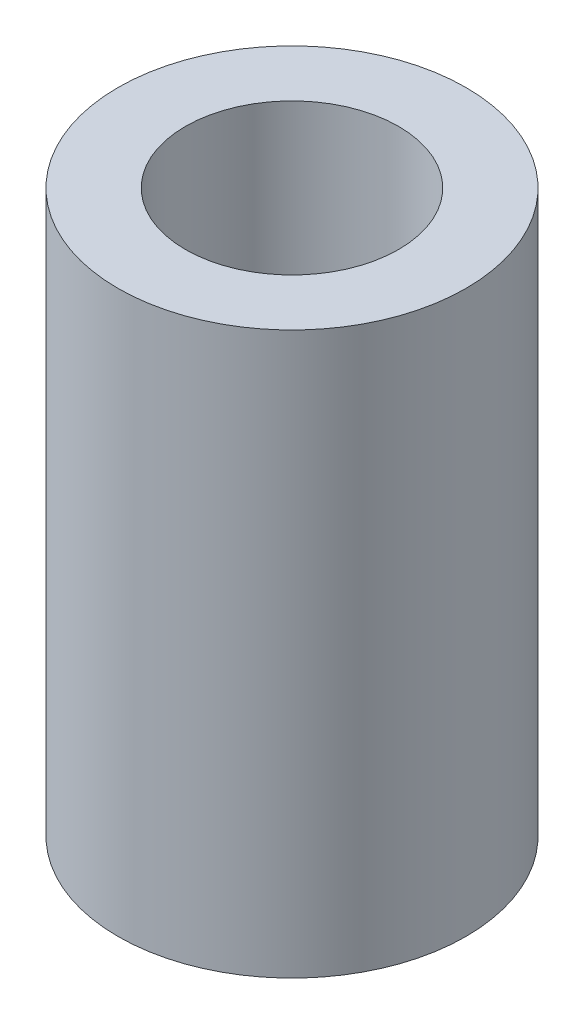
ISO-10303-21;
HEADER;
FILE_DESCRIPTION(('STEP AP214'),'2;1');
FILE_NAME('part.step','',(''),(''),'','','');
FILE_SCHEMA(('AUTOMOTIVE_DESIGN { 1 0 10303 214 1 1 1 1 }'));
ENDSEC;
DATA;
#1=APPLICATION_CONTEXT('core data for automotive mechanical design processes');
#2=APPLICATION_PROTOCOL_DEFINITION('international standard','automotive_design',2000,#1);
#3=PRODUCT_CONTEXT('',#1,'mechanical');
#4=PRODUCT('Part','Part','',(#3));
#5=PRODUCT_RELATED_PRODUCT_CATEGORY('part','',(#4));
#6=PRODUCT_DEFINITION_FORMATION('','',#4);
#7=PRODUCT_DEFINITION_CONTEXT('part definition',#1,'design');
#8=PRODUCT_DEFINITION('design','',#6,#7);
#9=PRODUCT_DEFINITION_SHAPE('','',#8);
#10=(LENGTH_UNIT() NAMED_UNIT(*) SI_UNIT(.MILLI.,.METRE.));
#11=(NAMED_UNIT(*) PLANE_ANGLE_UNIT() SI_UNIT($,.RADIAN.));
#12=(NAMED_UNIT(*) SI_UNIT($,.STERADIAN.) SOLID_ANGLE_UNIT());
#13=UNCERTAINTY_MEASURE_WITH_UNIT(LENGTH_MEASURE(1.E-05),#10,'distance_accuracy_value','');
#14=(GEOMETRIC_REPRESENTATION_CONTEXT(3) GLOBAL_UNCERTAINTY_ASSIGNED_CONTEXT((#13)) GLOBAL_UNIT_ASSIGNED_CONTEXT((#10,
#11,#12)) REPRESENTATION_CONTEXT('',''));
#15=CARTESIAN_POINT('',(0.,0.,0.));
#16=DIRECTION('',(0.,0.,1.));
#17=DIRECTION('',(1.,0.,0.));
#18=AXIS2_PLACEMENT_3D('',#15,#16,#17);
#19=CARTESIAN_POINT('',(-1.12375766391149,36.6,0.));
#20=DIRECTION('',(-1.,0.,0.));
#21=DIRECTION('',(0.,0.,1.));
#22=AXIS2_PLACEMENT_3D('',#19,#20,#21);
#23=PLANE('',#22);
#24=DIRECTION('',(0.,-1.,0.));
#25=VECTOR('',#24,1.);
#26=CARTESIAN_POINT('',(-1.12375766391149,36.6,1.06755267448505));
#27=LINE('',#26,#25);
#28=CARTESIAN_POINT('',(-1.12375766391149,8.7,1.06755267448505));
#29=VERTEX_POINT('',#28);
#30=CARTESIAN_POINT('',(-1.12375766391149,6.23497021876877,1.06755267448505));
#31=VERTEX_POINT('',#30);
#32=EDGE_CURVE('E154',#29,#31,#27,.T.);
#33=ORIENTED_EDGE('',*,*,#32,.T.);
#34=CARTESIAN_POINT('',(-1.12375766391149,4.19773403039988,0.));
#35=DIRECTION('',(-1.,0.,0.));
#36=DIRECTION('',(0.,0.,1.));
#37=AXIS2_PLACEMENT_3D('',#34,#35,#36);
#38=CIRCLE('',#37,2.3);
#39=CARTESIAN_POINT('',(-1.12375766391149,6.23497021876877,-1.06755267448505));
#40=VERTEX_POINT('',#39);
#41=EDGE_CURVE('E159',#31,#40,#38,.T.);
#42=ORIENTED_EDGE('',*,*,#41,.T.);
#43=DIRECTION('',(0.,-1.,0.));
#44=VECTOR('',#43,1.);
#45=CARTESIAN_POINT('',(-1.12375766391149,36.6,-1.06755267448505));
#46=LINE('',#45,#44);
#47=CARTESIAN_POINT('',(-1.12375766391149,8.7,-1.06755267448505));
#48=VERTEX_POINT('',#47);
#49=EDGE_CURVE('E119',#48,#40,#46,.T.);
#50=ORIENTED_EDGE('',*,*,#49,.F.);
#51=DIRECTION('',(0.,0.,-1.));
#52=VECTOR('',#51,1.);
#53=CARTESIAN_POINT('',(-1.12375766391149,8.7,0.));
#54=LINE('',#53,#52);
#55=EDGE_CURVE('E105',#29,#48,#54,.T.);
#56=ORIENTED_EDGE('',*,*,#55,.F.);
#57=EDGE_LOOP('',(#33,#42,#50,#56));
#58=FACE_BOUND('',#57,.T.);
#59=ADVANCED_FACE('F39',(#58),#23,.F.);
#60=CARTESIAN_POINT('',(0.,25.,0.));
#61=DIRECTION('',(0.,-1.,0.));
#62=DIRECTION('',(0.,0.,-1.));
#63=AXIS2_PLACEMENT_3D('',#60,#61,#62);
#64=CYLINDRICAL_SURFACE('',#63,4.75);
#65=CARTESIAN_POINT('',(0.,25.,0.));
#66=DIRECTION('',(0.,1.,0.));
#67=DIRECTION('',(0.,0.,1.));
#68=AXIS2_PLACEMENT_3D('',#65,#66,#67);
#69=CIRCLE('',#68,4.75);
#70=CARTESIAN_POINT('',(0.,25.,4.75));
#71=VERTEX_POINT('',#70);
#72=EDGE_CURVE('E169',#71,#71,#69,.T.);
#73=ORIENTED_EDGE('',*,*,#72,.T.);
#74=EDGE_LOOP('',(#73));
#75=FACE_BOUND('',#74,.T.);
#76=CARTESIAN_POINT('',(0.,8.7,0.));
#77=DIRECTION('',(0.,-1.,0.));
#78=DIRECTION('',(0.,0.,-1.));
#79=AXIS2_PLACEMENT_3D('',#76,#77,#78);
#80=CIRCLE('',#79,4.75);
#81=CARTESIAN_POINT('',(0.,8.7,-4.75));
#82=VERTEX_POINT('',#81);
#83=EDGE_CURVE('E163',#82,#82,#80,.T.);
#84=ORIENTED_EDGE('',*,*,#83,.T.);
#85=EDGE_LOOP('',(#84));
#86=FACE_BOUND('',#85,.T.);
#87=ADVANCED_FACE('F201',(#75,#86),#64,.F.);
#88=CARTESIAN_POINT('',(0.,25.,0.));
#89=DIRECTION('',(0.,-1.,0.));
#90=DIRECTION('',(0.,0.,-1.));
#91=AXIS2_PLACEMENT_3D('',#88,#89,#90);
#92=CYLINDRICAL_SURFACE('',#91,7.75);
#93=CARTESIAN_POINT('',(-7.40084454640144,4.19773403039988,-2.3));
#94=CARTESIAN_POINT('',(-7.40084596710491,4.3238342219509,-2.29999826061035));
#95=CARTESIAN_POINT('',(-7.40410267236931,4.44995166886507,-2.28959433657055));
#96=CARTESIAN_POINT('',(-7.41672693487905,4.6985039511843,-2.24835781646923));
#97=CARTESIAN_POINT('',(-7.42609663450528,4.82093747976796,-2.21751805833608));
#98=CARTESIAN_POINT('',(-7.44979425816975,5.0584880693148,-2.13654558421231));
#99=CARTESIAN_POINT('',(-7.46411406328841,5.17361674763033,-2.08644444479458));
#100=CARTESIAN_POINT('',(-7.49608749362793,5.39386204681906,-1.96847471285967));
#101=CARTESIAN_POINT('',(-7.5137415945252,5.49897723592774,-1.90060358471081));
#102=CARTESIAN_POINT('',(-7.55100758274335,5.6994670992972,-1.74677028598971));
#103=CARTESIAN_POINT('',(-7.57066049729886,5.79448582109711,-1.6603540389876));
#104=CARTESIAN_POINT('',(-7.60935889073277,5.96891760486302,-1.47285699392236));
#105=CARTESIAN_POINT('',(-7.6284042929153,6.0483287029133,-1.37177435315707));
#106=CARTESIAN_POINT('',(-7.66420696124225,6.19083047428014,-1.15528818238506));
#107=CARTESIAN_POINT('',(-7.68091024524189,6.25355913271964,-1.03963664794872));
#108=CARTESIAN_POINT('',(-7.70967060430952,6.35854015173924,-0.798846729124816));
#109=CARTESIAN_POINT('',(-7.7217286588025,6.40079682922552,-0.67371035123852));
#110=CARTESIAN_POINT('',(-7.73954966825425,6.4624590502671,-0.421226024082658));
#111=CARTESIAN_POINT('',(-7.74547961650724,6.48247196711275,-0.294038407770543));
#112=CARTESIAN_POINT('',(-7.75096393032413,6.50099812045078,-0.0379817805125363));
#113=CARTESIAN_POINT('',(-7.7505196073059,6.49951577929354,0.0908868791313423));
#114=CARTESIAN_POINT('',(-7.7434239222355,6.47550322092418,0.342389870740012));
#115=CARTESIAN_POINT('',(-7.73696648599736,6.45363057645066,0.465093315936343));
#116=CARTESIAN_POINT('',(-7.71880512648328,6.39053124036349,0.705002349244682));
#117=CARTESIAN_POINT('',(-7.7071008737427,6.34930333336245,0.822207591596089));
#118=CARTESIAN_POINT('',(-7.67949091982366,6.24821269449372,1.04936794217916));
#119=CARTESIAN_POINT('',(-7.66353849220174,6.18814130490513,1.15922428051381));
#120=CARTESIAN_POINT('',(-7.62912702070038,6.05123342536467,1.36750908889339));
#121=CARTESIAN_POINT('',(-7.61066739272996,5.97439302627483,1.46593488607622));
#122=CARTESIAN_POINT('',(-7.57239697054158,5.80270955915567,1.65248936300832));
#123=CARTESIAN_POINT('',(-7.55256147623185,5.70729630396951,1.74008893466056));
#124=CARTESIAN_POINT('',(-7.51438627788777,5.5029389977781,1.89819161794733));
#125=CARTESIAN_POINT('',(-7.4960467160745,5.39399366273112,1.96869310528961));
#126=CARTESIAN_POINT('',(-7.46282359054564,5.16429697089723,2.09113445545842));
#127=CARTESIAN_POINT('',(-7.4479734020001,5.04344614821127,2.14289743894261));
#128=CARTESIAN_POINT('',(-7.42380789677625,4.7942004591895,2.22518235059243));
#129=CARTESIAN_POINT('',(-7.41449081997391,4.6658080061997,2.25571103407667));
#130=CARTESIAN_POINT('',(-7.40283163852407,4.41015065417582,2.2936796395818));
#131=CARTESIAN_POINT('',(-7.40024714408484,4.28301593333333,2.30192234529745));
#132=CARTESIAN_POINT('',(-7.40167620065586,4.02917724983528,2.29732382076125));
#133=CARTESIAN_POINT('',(-7.40568885157593,3.90247323077974,2.28448546673172));
#134=CARTESIAN_POINT('',(-7.41962254419889,3.65641451987731,2.23880351521233));
#135=CARTESIAN_POINT('',(-7.42939179316149,3.53695503185814,2.20647339610327));
#136=CARTESIAN_POINT('',(-7.45358157267206,3.30516303796958,2.12331918638643));
#137=CARTESIAN_POINT('',(-7.46800281079959,3.19283161941044,2.07249228221912));
#138=CARTESIAN_POINT('',(-7.50034446361884,2.97520994053927,1.95225388685973));
#139=CARTESIAN_POINT('',(-7.51834711058228,2.87018340756084,1.88238773840295));
#140=CARTESIAN_POINT('',(-7.55564485018682,2.6730515560477,1.72659637939457));
#141=CARTESIAN_POINT('',(-7.57494024480165,2.58094927215363,1.64066740826764));
#142=CARTESIAN_POINT('',(-7.61350922017085,2.40878725470479,1.45142148380556));
#143=CARTESIAN_POINT('',(-7.6327558387679,2.32929579160812,1.34758080020375));
#144=CARTESIAN_POINT('',(-7.6683418951798,2.18885465773264,1.12757740491057));
#145=CARTESIAN_POINT('',(-7.68468147952493,2.12790405228421,1.0114153147562));
#146=CARTESIAN_POINT('',(-7.71251148021074,2.02686229511454,0.770844503911402));
#147=CARTESIAN_POINT('',(-7.72403816720745,1.98661456902562,0.646505953142204));
#148=CARTESIAN_POINT('',(-7.74110382957088,1.92771334987705,0.392427651456684));
#149=CARTESIAN_POINT('',(-7.74664447805598,1.909053822738,0.262689420303913));
#150=CARTESIAN_POINT('',(-7.75101421418239,1.89430955873376,0.00675166615421869));
#151=CARTESIAN_POINT('',(-7.75008858303398,1.89739983485735,-0.119396741236597));
#152=CARTESIAN_POINT('',(-7.74220549939041,1.92410102710831,-0.3692995490959));
#153=CARTESIAN_POINT('',(-7.7352483763988,1.94771082224386,-0.493054079965547));
#154=CARTESIAN_POINT('',(-7.71615190175865,2.01427431091141,-0.733416741463828));
#155=CARTESIAN_POINT('',(-7.7040667290909,2.05702601942284,-0.850085406075459));
#156=CARTESIAN_POINT('',(-7.6759648625946,2.16047940917894,-1.07465567940296));
#157=CARTESIAN_POINT('',(-7.65994753074731,2.2211840037251,-1.18255586158936));
#158=CARTESIAN_POINT('',(-7.62503996846125,2.36103784887781,-1.39021860108758));
#159=CARTESIAN_POINT('',(-7.60607514972016,2.44070775587925,-1.4896178778892));
#160=CARTESIAN_POINT('',(-7.56765460408595,2.61528809596758,-1.67391264494727));
#161=CARTESIAN_POINT('',(-7.54819873849178,2.71020287666161,-1.75880398346211));
#162=CARTESIAN_POINT('',(-7.51033645278872,2.91588087419198,-1.91414087210097));
#163=CARTESIAN_POINT('',(-7.49197678758514,3.02702367567372,-1.98409646894836));
#164=CARTESIAN_POINT('',(-7.45912537797488,3.26001939062547,-2.10424598972115));
#165=CARTESIAN_POINT('',(-7.44463170435396,3.381866921693,-2.15444977619488));
#166=CARTESIAN_POINT('',(-7.42264663975452,3.61855103184784,-2.22893436697839));
#167=CARTESIAN_POINT('',(-7.41454693949082,3.73261222901795,-2.25551171471803));
#168=CARTESIAN_POINT('',(-7.40364573686908,3.96368905055719,-2.29104366425712));
#169=CARTESIAN_POINT('',(-7.40084322788787,4.08070410932149,-2.30000161427695));
#170=CARTESIAN_POINT('',(-7.40084454640144,4.19773403039988,-2.3));
#171=B_SPLINE_CURVE_WITH_KNOTS('',3,(#93,#94,#95,#96,#97,#98,#99,#100,#101,#102,#103,#104,#105,
#106,#107,#108,#109,#110,#111,#112,#113,#114,#115,#116,#117,#118,#119,#120,#121,#122,#123,#124,
#125,#126,#127,#128,#129,#130,#131,#132,#133,#134,#135,#136,#137,#138,#139,#140,#141,#142,#143,
#144,#145,#146,#147,#148,#149,#150,#151,#152,#153,#154,#155,#156,#157,#158,#159,#160,#161,#162,
#163,#164,#165,#166,#167,#168,#169,#170),.UNSPECIFIED.,.T.,.F.,(4,2,2,2,2,2,2,2,2,2,2,2,2,2,2,2,
2,2,2,2,2,2,2,2,2,2,2,2,2,2,2,2,2,2,2,2,2,2,4),(0.,0.377869012965707,0.755870526385558,
1.1332549790472,1.51069331075154,1.89871941824612,2.28679432005994,2.68270713048679,
3.07853641879728,3.46326952469144,3.84792347822311,4.22058648988702,4.59327290554873,
4.97024120357905,5.34729747330635,5.7385903607886,6.12992040595729,6.52485354774898,
6.91966099097986,7.30004441548739,7.68037594619021,8.05110114594036,8.42188276055891,
8.80244015090164,9.18308674792963,9.57774874348553,9.97239084030002,10.3640027042959,
10.7555050830865,11.1322397208629,11.5089537787271,11.8817831586162,12.2546730725571,
12.6393060568089,13.0240489279669,13.4199420280461,13.8156371976433,14.1663931017357,
14.5170823451177),.UNSPECIFIED.);
#172=CARTESIAN_POINT('',(-7.40084454640144,4.19773403039988,-2.3));
#173=VERTEX_POINT('',#172);
#174=EDGE_CURVE('E230',#173,#173,#171,.T.);
#175=ORIENTED_EDGE('',*,*,#174,.T.);
#176=EDGE_LOOP('',(#175));
#177=FACE_BOUND('',#176,.T.);
#178=CARTESIAN_POINT('',(0.,0.,0.));
#179=DIRECTION('',(0.,1.,0.));
#180=DIRECTION('',(0.,0.,1.));
#181=AXIS2_PLACEMENT_3D('',#178,#179,#180);
#182=CIRCLE('',#181,7.75);
#183=CARTESIAN_POINT('',(0.,0.,7.75));
#184=VERTEX_POINT('',#183);
#185=EDGE_CURVE('E180',#184,#184,#182,.T.);
#186=ORIENTED_EDGE('',*,*,#185,.T.);
#187=EDGE_LOOP('',(#186));
#188=FACE_BOUND('',#187,.T.);
#189=CARTESIAN_POINT('',(0.,25.,0.));
#190=DIRECTION('',(0.,1.,0.));
#191=DIRECTION('',(0.,0.,1.));
#192=AXIS2_PLACEMENT_3D('',#189,#190,#191);
#193=CIRCLE('',#192,7.75);
#194=CARTESIAN_POINT('',(0.,25.,7.75));
#195=VERTEX_POINT('',#194);
#196=EDGE_CURVE('E181',#195,#195,#193,.T.);
#197=ORIENTED_EDGE('',*,*,#196,.F.);
#198=EDGE_LOOP('',(#197));
#199=FACE_BOUND('',#198,.T.);
#200=ADVANCED_FACE('F41',(#177,#188,#199),#92,.T.);
#201=CARTESIAN_POINT('',(0.,25.,0.));
#202=DIRECTION('',(0.,1.,0.));
#203=DIRECTION('',(0.,0.,1.));
#204=AXIS2_PLACEMENT_3D('',#201,#202,#203);
#205=PLANE('',#204);
#206=ORIENTED_EDGE('',*,*,#72,.F.);
#207=EDGE_LOOP('',(#206));
#208=FACE_BOUND('',#207,.T.);
#209=ORIENTED_EDGE('',*,*,#196,.T.);
#210=EDGE_LOOP('',(#209));
#211=FACE_BOUND('',#210,.T.);
#212=ADVANCED_FACE('F209',(#208,#211),#205,.T.);
#213=CARTESIAN_POINT('',(0.,0.,0.));
#214=DIRECTION('',(0.,1.,0.));
#215=DIRECTION('',(0.,0.,1.));
#216=AXIS2_PLACEMENT_3D('',#213,#214,#215);
#217=PLANE('',#216);
#218=CARTESIAN_POINT('',(0.,0.,0.));
#219=DIRECTION('',(0.,-1.,0.));
#220=DIRECTION('',(0.,0.,-1.));
#221=AXIS2_PLACEMENT_3D('',#218,#219,#220);
#222=CIRCLE('',#221,1.55);
#223=CARTESIAN_POINT('',(-1.12375766391149,0.,-1.06755267448505));
#224=VERTEX_POINT('',#223);
#225=CARTESIAN_POINT('',(-1.12375766391149,0.,1.06755267448505));
#226=VERTEX_POINT('',#225);
#227=EDGE_CURVE('E173',#224,#226,#222,.T.);
#228=ORIENTED_EDGE('',*,*,#227,.F.);
#229=DIRECTION('',(0.,0.,-1.));
#230=VECTOR('',#229,1.);
#231=CARTESIAN_POINT('',(-1.12375766391149,0.,0.));
#232=LINE('',#231,#230);
#233=EDGE_CURVE('E226',#226,#224,#232,.T.);
#234=ORIENTED_EDGE('',*,*,#233,.F.);
#235=EDGE_LOOP('',(#228,#234));
#236=FACE_BOUND('',#235,.T.);
#237=ORIENTED_EDGE('',*,*,#185,.F.);
#238=EDGE_LOOP('',(#237));
#239=FACE_BOUND('',#238,.T.);
#240=ADVANCED_FACE('F197',(#236,#239),#217,.F.);
#241=CARTESIAN_POINT('',(0.,8.7,0.));
#242=DIRECTION('',(0.,-1.,0.));
#243=DIRECTION('',(0.,0.,-1.));
#244=AXIS2_PLACEMENT_3D('',#241,#242,#243);
#245=PLANE('',#244);
#246=CARTESIAN_POINT('',(0.,8.7,0.));
#247=DIRECTION('',(0.,-1.,0.));
#248=DIRECTION('',(0.,0.,-1.));
#249=AXIS2_PLACEMENT_3D('',#246,#247,#248);
#250=CIRCLE('',#249,1.55);
#251=EDGE_CURVE('E185',#48,#29,#250,.T.);
#252=ORIENTED_EDGE('',*,*,#251,.T.);
#253=ORIENTED_EDGE('',*,*,#55,.T.);
#254=EDGE_LOOP('',(#252,#253));
#255=FACE_BOUND('',#254,.T.);
#256=ORIENTED_EDGE('',*,*,#83,.F.);
#257=EDGE_LOOP('',(#256));
#258=FACE_BOUND('',#257,.T.);
#259=ADVANCED_FACE('F193',(#255,#258),#245,.F.);
#260=CARTESIAN_POINT('',(-1.12375766391149,2.16049784203099,-1.06755267448505));
#261=VERTEX_POINT('',#260);
#262=EDGE_CURVE('E69',#261,#224,#46,.T.);
#263=ORIENTED_EDGE('',*,*,#262,.F.);
#264=CARTESIAN_POINT('',(-1.12375766391149,2.16049784203098,1.06755267448505));
#265=VERTEX_POINT('',#264);
#266=EDGE_CURVE('E238',#261,#265,#38,.T.);
#267=ORIENTED_EDGE('',*,*,#266,.T.);
#268=EDGE_CURVE('E164',#265,#226,#27,.T.);
#269=ORIENTED_EDGE('',*,*,#268,.T.);
#270=ORIENTED_EDGE('',*,*,#233,.T.);
#271=EDGE_LOOP('',(#263,#267,#269,#270));
#272=FACE_BOUND('',#271,.T.);
#273=ADVANCED_FACE('F196',(#272),#23,.F.);
#274=CARTESIAN_POINT('',(0.,36.6,0.));
#275=DIRECTION('',(0.,-1.,0.));
#276=DIRECTION('',(0.,0.,-1.));
#277=AXIS2_PLACEMENT_3D('',#274,#275,#276);
#278=CYLINDRICAL_SURFACE('',#277,1.55);
#279=ORIENTED_EDGE('',*,*,#268,.F.);
#280=CARTESIAN_POINT('',(-1.12375766391149,2.16049784203099,1.06755267448505));
#281=CARTESIAN_POINT('',(-1.09349152004454,2.17718555563392,1.09940004871879));
#282=CARTESIAN_POINT('',(-1.06196810659747,2.19411287651169,1.12988269107502));
#283=CARTESIAN_POINT('',(-0.996453178613224,2.22805703510384,1.18806938445257));
#284=CARTESIAN_POINT('',(-0.962459969932093,2.24507392669378,1.21577149656352));
#285=CARTESIAN_POINT('',(-0.856203648204659,2.29597686087478,1.29509788842651));
#286=CARTESIAN_POINT('',(-0.780275043244261,2.32936318215511,1.34229806599044));
#287=CARTESIAN_POINT('',(-0.634798175693357,2.38476895987886,1.41593551217266));
#288=CARTESIAN_POINT('',(-0.566738367472932,2.40774514749086,1.44460855251526));
#289=CARTESIAN_POINT('',(-0.425887393938615,2.4471996075605,1.49217449493291));
#290=CARTESIAN_POINT('',(-0.353131372592111,2.46372081050708,1.51113228324609));
#291=CARTESIAN_POINT('',(-0.233259790295284,2.48311966204606,1.53304444421605));
#292=CARTESIAN_POINT('',(-0.187193274999297,2.48880499357613,1.53935598358536));
#293=CARTESIAN_POINT('',(-0.0941052331111532,2.49651228646205,1.54785495585781));
#294=CARTESIAN_POINT('',(-0.047079652638004,2.49851222715617,1.55001760174631));
#295=CARTESIAN_POINT('',(0.,2.49846948360323,1.55));
#296=B_SPLINE_CURVE_WITH_KNOTS('',3,(#280,#281,#282,#283,#284,#285,#286,#287,#288,#289,#290,
#291,#292,#293,#294,#295),.UNSPECIFIED.,.F.,.F.,(4,2,2,2,2,2,2,4),(0.,0.140896582681479,
0.281890742127566,0.566713806866687,0.797934436911602,1.02758997728528,1.16780822184986,
1.30886160432119),.UNSPECIFIED.);
#297=CARTESIAN_POINT('',(0.,2.49846948360323,1.55));
#298=VERTEX_POINT('',#297);
#299=EDGE_CURVE('E11',#265,#298,#296,.T.);
#300=ORIENTED_EDGE('',*,*,#299,.T.);
#301=DIRECTION('',(0.,-1.,0.));
#302=VECTOR('',#301,1.);
#303=CARTESIAN_POINT('',(0.,36.6,1.55));
#304=LINE('',#303,#302);
#305=CARTESIAN_POINT('',(0.,5.89699857719652,1.55));
#306=VERTEX_POINT('',#305);
#307=EDGE_CURVE('E121',#298,#306,#304,.F.);
#308=ORIENTED_EDGE('',*,*,#307,.T.);
#309=CARTESIAN_POINT('',(0.,5.89699857719652,1.55));
#310=CARTESIAN_POINT('',(-0.0379937298960293,5.89697696649125,1.55001011468601));
#311=CARTESIAN_POINT('',(-0.075973965433616,5.89827225431097,1.54860350789037));
#312=CARTESIAN_POINT('',(-0.151515808553169,5.90333020495039,1.54303819660643));
#313=CARTESIAN_POINT('',(-0.189077922519262,5.90708945239256,1.53888330154008));
#314=CARTESIAN_POINT('',(-0.263086841355475,5.91685537665889,1.52796314821494));
#315=CARTESIAN_POINT('',(-0.299541390441416,5.92283670727344,1.52122730336262));
#316=CARTESIAN_POINT('',(-0.371514444037046,5.93677857022822,1.50526969280029));
#317=CARTESIAN_POINT('',(-0.407032670153006,5.94473968403094,1.49604719669345));
#318=CARTESIAN_POINT('',(-0.511480388637097,5.97103429775617,1.46497065171209));
#319=CARTESIAN_POINT('',(-0.578778633337594,5.99184879329765,1.43963465593238));
#320=CARTESIAN_POINT('',(-0.708296901231901,6.03770281495714,1.38054916214362));
#321=CARTESIAN_POINT('',(-0.770493489671996,6.06276037680763,1.34676344207502));
#322=CARTESIAN_POINT('',(-0.883928756108451,6.11253464691921,1.27486294174733));
#323=CARTESIAN_POINT('',(-0.935650079875646,6.13708729259138,1.23739078556541));
#324=CARTESIAN_POINT('',(-1.03369315437506,6.18626978850678,1.15670354713952));
#325=CARTESIAN_POINT('',(-1.08004881270944,6.2108980147994,1.11352869394622));
#326=CARTESIAN_POINT('',(-1.12375766391149,6.23497021876877,1.06755267448505));
#327=B_SPLINE_CURVE_WITH_KNOTS('',3,(#309,#310,#311,#312,#313,#314,#315,#316,#317,#318,#319,
#320,#321,#322,#323,#324,#325,#326),.UNSPECIFIED.,.F.,.F.,(4,2,2,2,2,2,2,2,4),(0.,
0.113911376020818,0.227665188617193,0.340159429760064,0.452686749571833,0.676301256729654,
0.900891291338204,1.10571674360363,1.30916759189888),.UNSPECIFIED.);
#328=EDGE_CURVE('E55',#306,#31,#327,.T.);
#329=ORIENTED_EDGE('',*,*,#328,.T.);
#330=ORIENTED_EDGE('',*,*,#32,.F.);
#331=ORIENTED_EDGE('',*,*,#251,.F.);
#332=ORIENTED_EDGE('',*,*,#49,.T.);
#333=CARTESIAN_POINT('',(-1.12375766391149,6.23497021876877,-1.06755267448505));
#334=CARTESIAN_POINT('',(-1.09349152004454,6.21828250516584,-1.09940004871879));
#335=CARTESIAN_POINT('',(-1.06196810659747,6.20135518428807,-1.12988269107502));
#336=CARTESIAN_POINT('',(-0.996453178613227,6.16741102569592,-1.18806938445257));
#337=CARTESIAN_POINT('',(-0.962459969932095,6.15039413410597,-1.21577149656352));
#338=CARTESIAN_POINT('',(-0.856203648204662,6.09949119992497,-1.29509788842651));
#339=CARTESIAN_POINT('',(-0.780275043244263,6.06610487864464,-1.34229806599044));
#340=CARTESIAN_POINT('',(-0.634798175693359,6.0106991009209,-1.41593551217266));
#341=CARTESIAN_POINT('',(-0.566738367472934,5.98772291330889,-1.44460855251526));
#342=CARTESIAN_POINT('',(-0.425887393938618,5.94826845323925,-1.49217449493291));
#343=CARTESIAN_POINT('',(-0.353131372592114,5.93174725029268,-1.51113228324609));
#344=CARTESIAN_POINT('',(-0.233259790295285,5.91234839875369,-1.53304444421605));
#345=CARTESIAN_POINT('',(-0.187193274999298,5.90666306722363,-1.53935598358536));
#346=CARTESIAN_POINT('',(-0.0941052331111538,5.8989557743377,-1.54785495585781));
#347=CARTESIAN_POINT('',(-0.0470796526380042,5.89695583364359,-1.55001760174631));
#348=CARTESIAN_POINT('',(0.,5.89699857719652,-1.55));
#349=B_SPLINE_CURVE_WITH_KNOTS('',3,(#333,#334,#335,#336,#337,#338,#339,#340,#341,#342,#343,
#344,#345,#346,#347,#348),.UNSPECIFIED.,.F.,.F.,(4,2,2,2,2,2,2,4),(0.,0.140896582681478,
0.281890742127566,0.566713806866687,0.797934436911603,1.02758997728528,1.16780822184987,
1.30886160432119),.UNSPECIFIED.);
#350=CARTESIAN_POINT('',(0.,5.89699857719652,-1.55));
#351=VERTEX_POINT('',#350);
#352=EDGE_CURVE('E110',#40,#351,#349,.T.);
#353=ORIENTED_EDGE('',*,*,#352,.T.);
#354=DIRECTION('',(0.,-1.,0.));
#355=VECTOR('',#354,1.);
#356=CARTESIAN_POINT('',(0.,36.6,-1.55));
#357=LINE('',#356,#355);
#358=CARTESIAN_POINT('',(0.,2.49846948360323,-1.55));
#359=VERTEX_POINT('',#358);
#360=EDGE_CURVE('E100',#351,#359,#357,.T.);
#361=ORIENTED_EDGE('',*,*,#360,.T.);
#362=CARTESIAN_POINT('',(0.,2.49846948360323,-1.55));
#363=CARTESIAN_POINT('',(-0.0379937298960293,2.4984910943085,-1.55001011468601));
#364=CARTESIAN_POINT('',(-0.075973965433616,2.49719580648878,-1.54860350789037));
#365=CARTESIAN_POINT('',(-0.151515808553169,2.49213785584936,-1.54303819660643));
#366=CARTESIAN_POINT('',(-0.189077922519262,2.4883786084072,-1.53888330154008));
#367=CARTESIAN_POINT('',(-0.263086841355475,2.47861268414086,-1.52796314821494));
#368=CARTESIAN_POINT('',(-0.299541390441416,2.47263135352632,-1.52122730336262));
#369=CARTESIAN_POINT('',(-0.371514444037046,2.45868949057153,-1.50526969280029));
#370=CARTESIAN_POINT('',(-0.407032670153006,2.45072837676882,-1.49604719669345));
#371=CARTESIAN_POINT('',(-0.511480388637097,2.42443376304358,-1.46497065171209));
#372=CARTESIAN_POINT('',(-0.578778633337595,2.40361926750211,-1.43963465593238));
#373=CARTESIAN_POINT('',(-0.708296901231902,2.35776524584261,-1.38054916214362));
#374=CARTESIAN_POINT('',(-0.770493489671997,2.33270768399212,-1.34676344207502));
#375=CARTESIAN_POINT('',(-0.883928756108451,2.28293341388054,-1.27486294174733));
#376=CARTESIAN_POINT('',(-0.935650079875646,2.25838076820837,-1.23739078556541));
#377=CARTESIAN_POINT('',(-1.03369315437506,2.20919827229297,-1.15670354713952));
#378=CARTESIAN_POINT('',(-1.08004881270944,2.18457004600035,-1.11352869394622));
#379=CARTESIAN_POINT('',(-1.12375766391149,2.16049784203099,-1.06755267448505));
#380=B_SPLINE_CURVE_WITH_KNOTS('',3,(#362,#363,#364,#365,#366,#367,#368,#369,#370,#371,#372,
#373,#374,#375,#376,#377,#378,#379),.UNSPECIFIED.,.F.,.F.,(4,2,2,2,2,2,2,2,4),(0.,
0.113911376020818,0.227665188617193,0.340159429760064,0.452686749571834,0.676301256729654,
0.900891291338204,1.10571674360363,1.30916759189889),.UNSPECIFIED.);
#381=EDGE_CURVE('E104',#359,#261,#380,.T.);
#382=ORIENTED_EDGE('',*,*,#381,.T.);
#383=ORIENTED_EDGE('',*,*,#262,.T.);
#384=ORIENTED_EDGE('',*,*,#227,.T.);
#385=EDGE_LOOP('',(#279,#300,#308,#329,#330,#331,#332,#353,#361,#382,#383,#384));
#386=FACE_BOUND('',#385,.T.);
#387=ADVANCED_FACE('F117',(#386),#278,.F.);
#388=CARTESIAN_POINT('',(-8.49999999999999,4.19773403039988,0.));
#389=DIRECTION('',(1.,0.,0.));
#390=DIRECTION('',(0.,0.,-1.));
#391=AXIS2_PLACEMENT_3D('',#388,#389,#390);
#392=CYLINDRICAL_SURFACE('',#391,2.3);
#393=ORIENTED_EDGE('',*,*,#41,.F.);
#394=ORIENTED_EDGE('',*,*,#328,.F.);
#395=CARTESIAN_POINT('',(0.,4.19773403039988,0.));
#396=DIRECTION('',(1.,0.,0.));
#397=DIRECTION('',(0.,0.,-1.));
#398=AXIS2_PLACEMENT_3D('',#395,#396,#397);
#399=CIRCLE('',#398,2.3);
#400=EDGE_CURVE('E113',#306,#298,#399,.T.);
#401=ORIENTED_EDGE('',*,*,#400,.T.);
#402=ORIENTED_EDGE('',*,*,#299,.F.);
#403=ORIENTED_EDGE('',*,*,#266,.F.);
#404=ORIENTED_EDGE('',*,*,#381,.F.);
#405=EDGE_CURVE('E61',#359,#351,#399,.T.);
#406=ORIENTED_EDGE('',*,*,#405,.T.);
#407=ORIENTED_EDGE('',*,*,#352,.F.);
#408=EDGE_LOOP('',(#393,#394,#401,#402,#403,#404,#406,#407));
#409=FACE_BOUND('',#408,.T.);
#410=ORIENTED_EDGE('',*,*,#174,.F.);
#411=EDGE_LOOP('',(#410));
#412=FACE_BOUND('',#411,.T.);
#413=ADVANCED_FACE('F108',(#409,#412),#392,.F.);
#414=CARTESIAN_POINT('',(0.,4.19773403039988,0.));
#415=DIRECTION('',(1.,0.,0.));
#416=DIRECTION('',(0.,0.,-1.));
#417=AXIS2_PLACEMENT_3D('',#414,#415,#416);
#418=PLANE('',#417);
#419=ORIENTED_EDGE('',*,*,#400,.F.);
#420=ORIENTED_EDGE('',*,*,#307,.F.);
#421=EDGE_LOOP('',(#419,#420));
#422=FACE_BOUND('',#421,.T.);
#423=ADVANCED_FACE('F141',(#422),#418,.F.);
#424=ORIENTED_EDGE('',*,*,#405,.F.);
#425=ORIENTED_EDGE('',*,*,#360,.F.);
#426=EDGE_LOOP('',(#424,#425));
#427=FACE_BOUND('',#426,.T.);
#428=ADVANCED_FACE('F101',(#427),#418,.F.);
#429=CLOSED_SHELL('',(#59,#87,#200,#212,#240,#259,#273,#387,#413,#423,#428));
#430=MANIFOLD_SOLID_BREP('B2',#429);
#431=ADVANCED_BREP_SHAPE_REPRESENTATION('',(#18,#430),#14);
#432=SHAPE_DEFINITION_REPRESENTATION(#9,#431);
ENDSEC;
END-ISO-10303-21;
